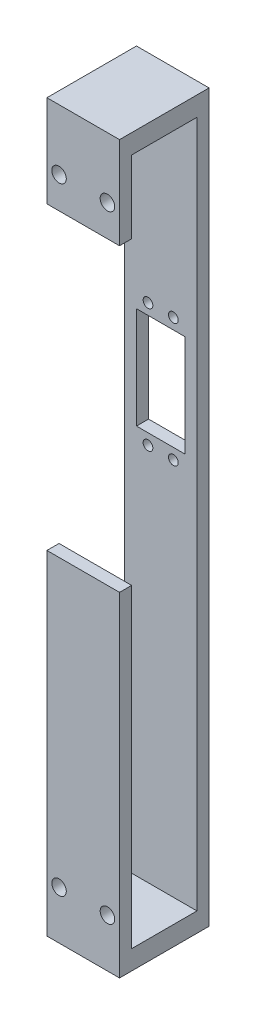
ISO-10303-21;
HEADER;
FILE_DESCRIPTION(('STEP AP214'),'2;1');
FILE_NAME('part.step','',(''),(''),'','','');
FILE_SCHEMA(('AUTOMOTIVE_DESIGN { 1 0 10303 214 1 1 1 1 }'));
ENDSEC;
DATA;
#1=APPLICATION_CONTEXT('core data for automotive mechanical design processes');
#2=APPLICATION_PROTOCOL_DEFINITION('international standard','automotive_design',2000,#1);
#3=PRODUCT_CONTEXT('',#1,'mechanical');
#4=PRODUCT('Part','Part','',(#3));
#5=PRODUCT_RELATED_PRODUCT_CATEGORY('part','',(#4));
#6=PRODUCT_DEFINITION_FORMATION('','',#4);
#7=PRODUCT_DEFINITION_CONTEXT('part definition',#1,'design');
#8=PRODUCT_DEFINITION('design','',#6,#7);
#9=PRODUCT_DEFINITION_SHAPE('','',#8);
#10=(LENGTH_UNIT() NAMED_UNIT(*) SI_UNIT(.MILLI.,.METRE.));
#11=(NAMED_UNIT(*) PLANE_ANGLE_UNIT() SI_UNIT($,.RADIAN.));
#12=(NAMED_UNIT(*) SI_UNIT($,.STERADIAN.) SOLID_ANGLE_UNIT());
#13=UNCERTAINTY_MEASURE_WITH_UNIT(LENGTH_MEASURE(1.E-05),#10,'distance_accuracy_value','');
#14=(GEOMETRIC_REPRESENTATION_CONTEXT(3) GLOBAL_UNCERTAINTY_ASSIGNED_CONTEXT((#13)) GLOBAL_UNIT_ASSIGNED_CONTEXT((#10,
#11,#12)) REPRESENTATION_CONTEXT('',''));
#15=CARTESIAN_POINT('',(0.,0.,0.));
#16=DIRECTION('',(0.,0.,1.));
#17=DIRECTION('',(1.,0.,0.));
#18=AXIS2_PLACEMENT_3D('',#15,#16,#17);
#19=CARTESIAN_POINT('',(0.,0.,37.));
#20=DIRECTION('',(0.,0.,1.));
#21=DIRECTION('',(1.,0.,0.));
#22=AXIS2_PLACEMENT_3D('',#19,#20,#21);
#23=PLANE('',#22);
#24=DIRECTION('',(0.,-1.,0.));
#25=VECTOR('',#24,1.);
#26=CARTESIAN_POINT('',(-4.99999999999999,-102.,37.));
#27=LINE('',#26,#25);
#28=CARTESIAN_POINT('',(-4.99999999999998,-72.,37.));
#29=VERTEX_POINT('',#28);
#30=CARTESIAN_POINT('',(-5.,-210.,37.));
#31=VERTEX_POINT('',#30);
#32=EDGE_CURVE('E285',#29,#31,#27,.T.);
#33=ORIENTED_EDGE('',*,*,#32,.T.);
#34=DIRECTION('',(-1.,0.,0.));
#35=VECTOR('',#34,1.);
#36=CARTESIAN_POINT('',(25.,-210.,37.));
#37=LINE('',#36,#35);
#38=CARTESIAN_POINT('',(25.,-210.,37.));
#39=VERTEX_POINT('',#38);
#40=EDGE_CURVE('E232',#39,#31,#37,.T.);
#41=ORIENTED_EDGE('',*,*,#40,.F.);
#42=DIRECTION('',(0.,1.,0.));
#43=VECTOR('',#42,1.);
#44=CARTESIAN_POINT('',(25.,-110.,37.));
#45=LINE('',#44,#43);
#46=CARTESIAN_POINT('',(25.,-72.,37.));
#47=VERTEX_POINT('',#46);
#48=EDGE_CURVE('E283',#39,#47,#45,.T.);
#49=ORIENTED_EDGE('',*,*,#48,.T.);
#50=DIRECTION('',(1.,0.,0.));
#51=VECTOR('',#50,1.);
#52=CARTESIAN_POINT('',(0.,-72.,37.));
#53=LINE('',#52,#51);
#54=EDGE_CURVE('E261',#29,#47,#53,.T.);
#55=ORIENTED_EDGE('',*,*,#54,.F.);
#56=EDGE_LOOP('',(#33,#41,#49,#55));
#57=FACE_BOUND('',#56,.T.);
#58=CARTESIAN_POINT('',(20.,-190.,37.));
#59=DIRECTION('',(0.,0.,1.));
#60=DIRECTION('',(1.,0.,0.));
#61=AXIS2_PLACEMENT_3D('',#58,#59,#60);
#62=CIRCLE('',#61,3.);
#63=CARTESIAN_POINT('',(23.,-190.,37.));
#64=VERTEX_POINT('',#63);
#65=EDGE_CURVE('E198',#64,#64,#62,.T.);
#66=ORIENTED_EDGE('',*,*,#65,.F.);
#67=EDGE_LOOP('',(#66));
#68=FACE_BOUND('',#67,.T.);
#69=CARTESIAN_POINT('',(0.,-190.,37.));
#70=DIRECTION('',(0.,0.,1.));
#71=DIRECTION('',(1.,0.,0.));
#72=AXIS2_PLACEMENT_3D('',#69,#70,#71);
#73=CIRCLE('',#72,3.);
#74=CARTESIAN_POINT('',(3.,-190.,37.));
#75=VERTEX_POINT('',#74);
#76=EDGE_CURVE('E199',#75,#75,#73,.F.);
#77=ORIENTED_EDGE('',*,*,#76,.T.);
#78=EDGE_LOOP('',(#77));
#79=FACE_BOUND('',#78,.T.);
#80=ADVANCED_FACE('F44',(#57,#68,#79),#23,.T.);
#81=CARTESIAN_POINT('',(0.,-72.,32.));
#82=DIRECTION('',(0.,0.,1.));
#83=DIRECTION('',(1.,0.,0.));
#84=AXIS2_PLACEMENT_3D('',#81,#82,#83);
#85=PLANE('',#84);
#86=CARTESIAN_POINT('',(20.,-190.,32.));
#87=DIRECTION('',(0.,0.,1.));
#88=DIRECTION('',(1.,0.,0.));
#89=AXIS2_PLACEMENT_3D('',#86,#87,#88);
#90=CIRCLE('',#89,3.);
#91=CARTESIAN_POINT('',(23.,-190.,32.));
#92=VERTEX_POINT('',#91);
#93=EDGE_CURVE('E202',#92,#92,#90,.T.);
#94=ORIENTED_EDGE('',*,*,#93,.T.);
#95=EDGE_LOOP('',(#94));
#96=FACE_BOUND('',#95,.T.);
#97=DIRECTION('',(0.,-1.,0.));
#98=VECTOR('',#97,1.);
#99=CARTESIAN_POINT('',(25.,-72.,32.));
#100=LINE('',#99,#98);
#101=CARTESIAN_POINT('',(25.,-72.,32.));
#102=VERTEX_POINT('',#101);
#103=CARTESIAN_POINT('',(25.,-202.,32.));
#104=VERTEX_POINT('',#103);
#105=EDGE_CURVE('E266',#102,#104,#100,.T.);
#106=ORIENTED_EDGE('',*,*,#105,.T.);
#107=DIRECTION('',(1.,0.,0.));
#108=VECTOR('',#107,1.);
#109=CARTESIAN_POINT('',(-5.,-202.,32.));
#110=LINE('',#109,#108);
#111=CARTESIAN_POINT('',(-5.,-202.,32.));
#112=VERTEX_POINT('',#111);
#113=EDGE_CURVE('E208',#112,#104,#110,.T.);
#114=ORIENTED_EDGE('',*,*,#113,.F.);
#115=DIRECTION('',(0.,-1.,0.));
#116=VECTOR('',#115,1.);
#117=CARTESIAN_POINT('',(-4.99999999999999,-72.,32.));
#118=LINE('',#117,#116);
#119=CARTESIAN_POINT('',(-4.99999999999999,-72.,32.));
#120=VERTEX_POINT('',#119);
#121=EDGE_CURVE('E264',#120,#112,#118,.T.);
#122=ORIENTED_EDGE('',*,*,#121,.F.);
#123=DIRECTION('',(-1.,0.,0.));
#124=VECTOR('',#123,1.);
#125=CARTESIAN_POINT('',(0.,-72.,32.));
#126=LINE('',#125,#124);
#127=EDGE_CURVE('E256',#102,#120,#126,.T.);
#128=ORIENTED_EDGE('',*,*,#127,.F.);
#129=EDGE_LOOP('',(#106,#114,#122,#128));
#130=FACE_BOUND('',#129,.T.);
#131=CARTESIAN_POINT('',(0.,-190.,32.));
#132=DIRECTION('',(0.,0.,1.));
#133=DIRECTION('',(1.,0.,0.));
#134=AXIS2_PLACEMENT_3D('',#131,#132,#133);
#135=CIRCLE('',#134,3.);
#136=CARTESIAN_POINT('',(3.,-190.,32.));
#137=VERTEX_POINT('',#136);
#138=EDGE_CURVE('E48',#137,#137,#135,.F.);
#139=ORIENTED_EDGE('',*,*,#138,.F.);
#140=EDGE_LOOP('',(#139));
#141=FACE_BOUND('',#140,.T.);
#142=ADVANCED_FACE('F336',(#96,#130,#141),#85,.F.);
#143=CARTESIAN_POINT('',(0.,0.,37.));
#144=DIRECTION('',(0.,0.,1.));
#145=DIRECTION('',(1.,0.,0.));
#146=AXIS2_PLACEMENT_3D('',#143,#144,#145);
#147=PLANE('',#146);
#148=CARTESIAN_POINT('',(0.,65.,37.));
#149=DIRECTION('',(0.,0.,1.));
#150=DIRECTION('',(1.,0.,0.));
#151=AXIS2_PLACEMENT_3D('',#148,#149,#150);
#152=CIRCLE('',#151,3.);
#153=CARTESIAN_POINT('',(3.00000000000001,65.,37.));
#154=VERTEX_POINT('',#153);
#155=EDGE_CURVE('E218',#154,#154,#152,.F.);
#156=ORIENTED_EDGE('',*,*,#155,.T.);
#157=EDGE_LOOP('',(#156));
#158=FACE_BOUND('',#157,.T.);
#159=DIRECTION('',(0.,1.,0.));
#160=VECTOR('',#159,1.);
#161=CARTESIAN_POINT('',(25.,82.,37.));
#162=LINE('',#161,#160);
#163=CARTESIAN_POINT('',(25.,52.,37.));
#164=VERTEX_POINT('',#163);
#165=CARTESIAN_POINT('',(25.,90.,37.));
#166=VERTEX_POINT('',#165);
#167=EDGE_CURVE('E269',#164,#166,#162,.T.);
#168=ORIENTED_EDGE('',*,*,#167,.T.);
#169=DIRECTION('',(-1.,0.,0.));
#170=VECTOR('',#169,1.);
#171=CARTESIAN_POINT('',(25.,90.,37.));
#172=LINE('',#171,#170);
#173=CARTESIAN_POINT('',(-5.,90.,37.));
#174=VERTEX_POINT('',#173);
#175=EDGE_CURVE('E272',#166,#174,#172,.T.);
#176=ORIENTED_EDGE('',*,*,#175,.T.);
#177=DIRECTION('',(0.,-1.,0.));
#178=VECTOR('',#177,1.);
#179=CARTESIAN_POINT('',(-5.,90.,37.));
#180=LINE('',#179,#178);
#181=CARTESIAN_POINT('',(-4.99999999999999,52.,37.));
#182=VERTEX_POINT('',#181);
#183=EDGE_CURVE('E275',#174,#182,#180,.T.);
#184=ORIENTED_EDGE('',*,*,#183,.T.);
#185=DIRECTION('',(-1.,0.,0.));
#186=VECTOR('',#185,1.);
#187=CARTESIAN_POINT('',(-4.99999999999999,52.,37.));
#188=LINE('',#187,#186);
#189=EDGE_CURVE('E237',#164,#182,#188,.T.);
#190=ORIENTED_EDGE('',*,*,#189,.F.);
#191=EDGE_LOOP('',(#168,#176,#184,#190));
#192=FACE_BOUND('',#191,.T.);
#193=CARTESIAN_POINT('',(20.,65.,37.));
#194=DIRECTION('',(0.,0.,1.));
#195=DIRECTION('',(1.,0.,0.));
#196=AXIS2_PLACEMENT_3D('',#193,#194,#195);
#197=CIRCLE('',#196,3.);
#198=CARTESIAN_POINT('',(23.,65.,37.));
#199=VERTEX_POINT('',#198);
#200=EDGE_CURVE('E222',#199,#199,#197,.T.);
#201=ORIENTED_EDGE('',*,*,#200,.F.);
#202=EDGE_LOOP('',(#201));
#203=FACE_BOUND('',#202,.T.);
#204=ADVANCED_FACE('F338',(#158,#192,#203),#147,.T.);
#205=CARTESIAN_POINT('',(25.,52.,32.));
#206=DIRECTION('',(0.,0.,1.));
#207=DIRECTION('',(1.,0.,0.));
#208=AXIS2_PLACEMENT_3D('',#205,#206,#207);
#209=PLANE('',#208);
#210=DIRECTION('',(1.,0.,0.));
#211=VECTOR('',#210,1.);
#212=CARTESIAN_POINT('',(25.,82.,32.));
#213=LINE('',#212,#211);
#214=CARTESIAN_POINT('',(-4.99999999999999,82.,32.));
#215=VERTEX_POINT('',#214);
#216=CARTESIAN_POINT('',(25.,82.,32.));
#217=VERTEX_POINT('',#216);
#218=EDGE_CURVE('E235',#215,#217,#213,.T.);
#219=ORIENTED_EDGE('',*,*,#218,.T.);
#220=DIRECTION('',(0.,1.,0.));
#221=VECTOR('',#220,1.);
#222=CARTESIAN_POINT('',(25.,52.,32.));
#223=LINE('',#222,#221);
#224=CARTESIAN_POINT('',(25.,52.,32.));
#225=VERTEX_POINT('',#224);
#226=EDGE_CURVE('E247',#225,#217,#223,.T.);
#227=ORIENTED_EDGE('',*,*,#226,.F.);
#228=DIRECTION('',(1.,0.,0.));
#229=VECTOR('',#228,1.);
#230=CARTESIAN_POINT('',(25.,52.,32.));
#231=LINE('',#230,#229);
#232=CARTESIAN_POINT('',(-4.99999999999999,52.,32.));
#233=VERTEX_POINT('',#232);
#234=EDGE_CURVE('E242',#233,#225,#231,.T.);
#235=ORIENTED_EDGE('',*,*,#234,.F.);
#236=DIRECTION('',(0.,1.,0.));
#237=VECTOR('',#236,1.);
#238=CARTESIAN_POINT('',(-4.99999999999999,52.,32.));
#239=LINE('',#238,#237);
#240=EDGE_CURVE('E251',#233,#215,#239,.T.);
#241=ORIENTED_EDGE('',*,*,#240,.T.);
#242=EDGE_LOOP('',(#219,#227,#235,#241));
#243=FACE_BOUND('',#242,.T.);
#244=CARTESIAN_POINT('',(0.,65.,32.));
#245=DIRECTION('',(0.,0.,1.));
#246=DIRECTION('',(1.,0.,0.));
#247=AXIS2_PLACEMENT_3D('',#244,#245,#246);
#248=CIRCLE('',#247,3.);
#249=CARTESIAN_POINT('',(3.00000000000001,65.,32.));
#250=VERTEX_POINT('',#249);
#251=EDGE_CURVE('E215',#250,#250,#248,.F.);
#252=ORIENTED_EDGE('',*,*,#251,.F.);
#253=EDGE_LOOP('',(#252));
#254=FACE_BOUND('',#253,.T.);
#255=CARTESIAN_POINT('',(20.,65.,32.));
#256=DIRECTION('',(0.,0.,1.));
#257=DIRECTION('',(1.,0.,0.));
#258=AXIS2_PLACEMENT_3D('',#255,#256,#257);
#259=CIRCLE('',#258,3.);
#260=CARTESIAN_POINT('',(23.,65.,32.));
#261=VERTEX_POINT('',#260);
#262=EDGE_CURVE('E221',#261,#261,#259,.T.);
#263=ORIENTED_EDGE('',*,*,#262,.T.);
#264=EDGE_LOOP('',(#263));
#265=FACE_BOUND('',#264,.T.);
#266=ADVANCED_FACE('F344',(#243,#254,#265),#209,.F.);
#267=CARTESIAN_POINT('',(-5.,82.,37.));
#268=DIRECTION('',(0.,1.,0.));
#269=DIRECTION('',(0.,0.,1.));
#270=AXIS2_PLACEMENT_3D('',#267,#268,#269);
#271=PLANE('',#270);
#272=ORIENTED_EDGE('',*,*,#218,.F.);
#273=DIRECTION('',(0.,0.,-1.));
#274=VECTOR('',#273,1.);
#275=CARTESIAN_POINT('',(-5.,82.,37.));
#276=LINE('',#275,#274);
#277=CARTESIAN_POINT('',(-5.,82.,5.));
#278=VERTEX_POINT('',#277);
#279=EDGE_CURVE('E281',#215,#278,#276,.T.);
#280=ORIENTED_EDGE('',*,*,#279,.T.);
#281=DIRECTION('',(1.,0.,0.));
#282=VECTOR('',#281,1.);
#283=CARTESIAN_POINT('',(-5.,82.,5.));
#284=LINE('',#283,#282);
#285=CARTESIAN_POINT('',(25.,82.,5.));
#286=VERTEX_POINT('',#285);
#287=EDGE_CURVE('E268',#278,#286,#284,.T.);
#288=ORIENTED_EDGE('',*,*,#287,.T.);
#289=DIRECTION('',(0.,0.,-1.));
#290=VECTOR('',#289,1.);
#291=CARTESIAN_POINT('',(25.,82.,37.));
#292=LINE('',#291,#290);
#293=EDGE_CURVE('E277',#217,#286,#292,.T.);
#294=ORIENTED_EDGE('',*,*,#293,.F.);
#295=EDGE_LOOP('',(#272,#280,#288,#294));
#296=FACE_BOUND('',#295,.T.);
#297=ADVANCED_FACE('F354',(#296),#271,.F.);
#298=CARTESIAN_POINT('',(0.,0.,5.));
#299=DIRECTION('',(0.,0.,-1.));
#300=DIRECTION('',(-1.,0.,0.));
#301=AXIS2_PLACEMENT_3D('',#298,#299,#300);
#302=PLANE('',#301);
#303=ORIENTED_EDGE('',*,*,#287,.F.);
#304=DIRECTION('',(0.,-1.,0.));
#305=VECTOR('',#304,1.);
#306=CARTESIAN_POINT('',(-5.,-50.,5.));
#307=LINE('',#306,#305);
#308=CARTESIAN_POINT('',(-5.,-202.,4.99999999999999));
#309=VERTEX_POINT('',#308);
#310=EDGE_CURVE('E53',#278,#309,#307,.T.);
#311=ORIENTED_EDGE('',*,*,#310,.T.);
#312=DIRECTION('',(1.,0.,0.));
#313=VECTOR('',#312,1.);
#314=CARTESIAN_POINT('',(-5.,-202.,4.99999999999999));
#315=LINE('',#314,#313);
#316=CARTESIAN_POINT('',(25.,-202.,4.99999999999999));
#317=VERTEX_POINT('',#316);
#318=EDGE_CURVE('E212',#309,#317,#315,.T.);
#319=ORIENTED_EDGE('',*,*,#318,.T.);
#320=DIRECTION('',(0.,1.,0.));
#321=VECTOR('',#320,1.);
#322=CARTESIAN_POINT('',(25.,10.,5.));
#323=LINE('',#322,#321);
#324=EDGE_CURVE('E12',#317,#286,#323,.T.);
#325=ORIENTED_EDGE('',*,*,#324,.T.);
#326=EDGE_LOOP('',(#303,#311,#319,#325));
#327=FACE_BOUND('',#326,.T.);
#328=CARTESIAN_POINT('',(4.75,-45.5,5.));
#329=DIRECTION('',(0.,0.,1.));
#330=DIRECTION('',(1.,0.,0.));
#331=AXIS2_PLACEMENT_3D('',#328,#329,#330);
#332=CIRCLE('',#331,1.99999999999994);
#333=CARTESIAN_POINT('',(6.74999999999994,-45.5,5.));
#334=VERTEX_POINT('',#333);
#335=EDGE_CURVE('E294',#334,#334,#332,.T.);
#336=ORIENTED_EDGE('',*,*,#335,.F.);
#337=EDGE_LOOP('',(#336));
#338=FACE_BOUND('',#337,.T.);
#339=CARTESIAN_POINT('',(15.25,-45.5,5.));
#340=DIRECTION('',(0.,0.,1.));
#341=DIRECTION('',(1.,0.,0.));
#342=AXIS2_PLACEMENT_3D('',#339,#340,#341);
#343=CIRCLE('',#342,1.99999999999993);
#344=CARTESIAN_POINT('',(17.2499999999999,-45.5,5.));
#345=VERTEX_POINT('',#344);
#346=EDGE_CURVE('E305',#345,#345,#343,.F.);
#347=ORIENTED_EDGE('',*,*,#346,.T.);
#348=EDGE_LOOP('',(#347));
#349=FACE_BOUND('',#348,.T.);
#350=DIRECTION('',(-1.,0.,0.));
#351=VECTOR('',#350,1.);
#352=CARTESIAN_POINT('',(0.,-41.,5.));
#353=LINE('',#352,#351);
#354=CARTESIAN_POINT('',(20.,-41.,5.));
#355=VERTEX_POINT('',#354);
#356=CARTESIAN_POINT('',(0.,-41.,5.));
#357=VERTEX_POINT('',#356);
#358=EDGE_CURVE('E180',#355,#357,#353,.T.);
#359=ORIENTED_EDGE('',*,*,#358,.T.);
#360=DIRECTION('',(0.,-1.,0.));
#361=VECTOR('',#360,1.);
#362=CARTESIAN_POINT('',(0.,0.,5.));
#363=LINE('',#362,#361);
#364=CARTESIAN_POINT('',(0.,1.,5.));
#365=VERTEX_POINT('',#364);
#366=EDGE_CURVE('E170',#365,#357,#363,.T.);
#367=ORIENTED_EDGE('',*,*,#366,.F.);
#368=DIRECTION('',(1.,0.,0.));
#369=VECTOR('',#368,1.);
#370=CARTESIAN_POINT('',(0.,1.,5.));
#371=LINE('',#370,#369);
#372=CARTESIAN_POINT('',(20.,1.,5.));
#373=VERTEX_POINT('',#372);
#374=EDGE_CURVE('E189',#365,#373,#371,.T.);
#375=ORIENTED_EDGE('',*,*,#374,.T.);
#376=DIRECTION('',(0.,1.,0.));
#377=VECTOR('',#376,1.);
#378=CARTESIAN_POINT('',(20.,0.,5.));
#379=LINE('',#378,#377);
#380=EDGE_CURVE('E319',#355,#373,#379,.T.);
#381=ORIENTED_EDGE('',*,*,#380,.F.);
#382=EDGE_LOOP('',(#359,#367,#375,#381));
#383=FACE_BOUND('',#382,.T.);
#384=CARTESIAN_POINT('',(4.75,5.50000000000003,5.));
#385=DIRECTION('',(0.,0.,1.));
#386=DIRECTION('',(1.,0.,0.));
#387=AXIS2_PLACEMENT_3D('',#384,#385,#386);
#388=CIRCLE('',#387,2.);
#389=CARTESIAN_POINT('',(6.75,5.50000000000003,5.));
#390=VERTEX_POINT('',#389);
#391=EDGE_CURVE('E298',#390,#390,#388,.F.);
#392=ORIENTED_EDGE('',*,*,#391,.T.);
#393=EDGE_LOOP('',(#392));
#394=FACE_BOUND('',#393,.T.);
#395=CARTESIAN_POINT('',(15.25,5.50000000000003,5.));
#396=DIRECTION('',(0.,0.,1.));
#397=DIRECTION('',(1.,0.,0.));
#398=AXIS2_PLACEMENT_3D('',#395,#396,#397);
#399=CIRCLE('',#398,2.);
#400=CARTESIAN_POINT('',(17.25,5.50000000000003,5.));
#401=VERTEX_POINT('',#400);
#402=EDGE_CURVE('E299',#401,#401,#399,.T.);
#403=ORIENTED_EDGE('',*,*,#402,.F.);
#404=EDGE_LOOP('',(#403));
#405=FACE_BOUND('',#404,.T.);
#406=ADVANCED_FACE('F356',(#327,#338,#349,#383,#394,#405),#302,.F.);
#407=CARTESIAN_POINT('',(-5.,-50.,5.));
#408=DIRECTION('',(1.,0.,0.));
#409=DIRECTION('',(0.,0.,-1.));
#410=AXIS2_PLACEMENT_3D('',#407,#408,#409);
#411=PLANE('',#410);
#412=DIRECTION('',(0.,0.,-1.));
#413=VECTOR('',#412,1.);
#414=CARTESIAN_POINT('',(-5.,-202.,4.99999999999999));
#415=LINE('',#414,#413);
#416=EDGE_CURVE('E205',#112,#309,#415,.T.);
#417=ORIENTED_EDGE('',*,*,#416,.T.);
#418=ORIENTED_EDGE('',*,*,#310,.F.);
#419=ORIENTED_EDGE('',*,*,#279,.F.);
#420=ORIENTED_EDGE('',*,*,#240,.F.);
#421=DIRECTION('',(0.,0.,-1.));
#422=VECTOR('',#421,1.);
#423=CARTESIAN_POINT('',(-4.99999999999999,52.,37.));
#424=LINE('',#423,#422);
#425=EDGE_CURVE('E240',#182,#233,#424,.T.);
#426=ORIENTED_EDGE('',*,*,#425,.F.);
#427=ORIENTED_EDGE('',*,*,#183,.F.);
#428=DIRECTION('',(0.,0.,1.));
#429=VECTOR('',#428,1.);
#430=CARTESIAN_POINT('',(-5.,90.,0.));
#431=LINE('',#430,#429);
#432=CARTESIAN_POINT('',(-5.,90.,0.));
#433=VERTEX_POINT('',#432);
#434=EDGE_CURVE('E290',#433,#174,#431,.T.);
#435=ORIENTED_EDGE('',*,*,#434,.F.);
#436=DIRECTION('',(0.,-1.,0.));
#437=VECTOR('',#436,1.);
#438=CARTESIAN_POINT('',(-5.,-50.,0.));
#439=LINE('',#438,#437);
#440=CARTESIAN_POINT('',(-5.,-210.,0.));
#441=VERTEX_POINT('',#440);
#442=EDGE_CURVE('E69',#433,#441,#439,.T.);
#443=ORIENTED_EDGE('',*,*,#442,.T.);
#444=DIRECTION('',(0.,0.,1.));
#445=VECTOR('',#444,1.);
#446=CARTESIAN_POINT('',(-5.,-210.,0.));
#447=LINE('',#446,#445);
#448=EDGE_CURVE('E225',#441,#31,#447,.T.);
#449=ORIENTED_EDGE('',*,*,#448,.T.);
#450=ORIENTED_EDGE('',*,*,#32,.F.);
#451=DIRECTION('',(0.,0.,1.));
#452=VECTOR('',#451,1.);
#453=CARTESIAN_POINT('',(-4.99999999999999,-72.,0.));
#454=LINE('',#453,#452);
#455=EDGE_CURVE('E258',#120,#29,#454,.T.);
#456=ORIENTED_EDGE('',*,*,#455,.F.);
#457=ORIENTED_EDGE('',*,*,#121,.T.);
#458=EDGE_LOOP('',(#417,#418,#419,#420,#426,#427,#435,#443,#449,#450,#456,#457));
#459=FACE_BOUND('',#458,.T.);
#460=ADVANCED_FACE('F46',(#459),#411,.F.);
#461=CARTESIAN_POINT('',(25.,10.,5.));
#462=DIRECTION('',(-1.,0.,0.));
#463=DIRECTION('',(0.,0.,1.));
#464=AXIS2_PLACEMENT_3D('',#461,#462,#463);
#465=PLANE('',#464);
#466=ORIENTED_EDGE('',*,*,#324,.F.);
#467=DIRECTION('',(0.,0.,-1.));
#468=VECTOR('',#467,1.);
#469=CARTESIAN_POINT('',(25.,-202.,4.99999999999999));
#470=LINE('',#469,#468);
#471=EDGE_CURVE('E209',#104,#317,#470,.T.);
#472=ORIENTED_EDGE('',*,*,#471,.F.);
#473=ORIENTED_EDGE('',*,*,#105,.F.);
#474=DIRECTION('',(0.,0.,-1.));
#475=VECTOR('',#474,1.);
#476=CARTESIAN_POINT('',(25.,-72.,0.));
#477=LINE('',#476,#475);
#478=EDGE_CURVE('E253',#47,#102,#477,.T.);
#479=ORIENTED_EDGE('',*,*,#478,.F.);
#480=ORIENTED_EDGE('',*,*,#48,.F.);
#481=DIRECTION('',(0.,0.,1.));
#482=VECTOR('',#481,1.);
#483=CARTESIAN_POINT('',(25.,-210.,0.));
#484=LINE('',#483,#482);
#485=CARTESIAN_POINT('',(25.,-210.,0.));
#486=VERTEX_POINT('',#485);
#487=EDGE_CURVE('E226',#486,#39,#484,.T.);
#488=ORIENTED_EDGE('',*,*,#487,.F.);
#489=DIRECTION('',(0.,1.,0.));
#490=VECTOR('',#489,1.);
#491=CARTESIAN_POINT('',(25.,10.,0.));
#492=LINE('',#491,#490);
#493=CARTESIAN_POINT('',(25.,90.,0.));
#494=VERTEX_POINT('',#493);
#495=EDGE_CURVE('E61',#486,#494,#492,.T.);
#496=ORIENTED_EDGE('',*,*,#495,.T.);
#497=DIRECTION('',(0.,0.,-1.));
#498=VECTOR('',#497,1.);
#499=CARTESIAN_POINT('',(25.,90.,5.));
#500=LINE('',#499,#498);
#501=EDGE_CURVE('E292',#166,#494,#500,.T.);
#502=ORIENTED_EDGE('',*,*,#501,.F.);
#503=ORIENTED_EDGE('',*,*,#167,.F.);
#504=DIRECTION('',(0.,0.,1.));
#505=VECTOR('',#504,1.);
#506=CARTESIAN_POINT('',(25.,52.,37.));
#507=LINE('',#506,#505);
#508=EDGE_CURVE('E244',#225,#164,#507,.T.);
#509=ORIENTED_EDGE('',*,*,#508,.F.);
#510=ORIENTED_EDGE('',*,*,#226,.T.);
#511=ORIENTED_EDGE('',*,*,#293,.T.);
#512=EDGE_LOOP('',(#466,#472,#473,#479,#480,#488,#496,#502,#503,#509,#510,#511));
#513=FACE_BOUND('',#512,.T.);
#514=ADVANCED_FACE('F389',(#513),#465,.F.);
#515=CARTESIAN_POINT('',(0.,0.,0.));
#516=DIRECTION('',(0.,0.,-1.));
#517=DIRECTION('',(-1.,0.,0.));
#518=AXIS2_PLACEMENT_3D('',#515,#516,#517);
#519=PLANE('',#518);
#520=DIRECTION('',(0.,-1.,0.));
#521=VECTOR('',#520,1.);
#522=CARTESIAN_POINT('',(0.,0.,0.));
#523=LINE('',#522,#521);
#524=CARTESIAN_POINT('',(0.,1.,0.));
#525=VERTEX_POINT('',#524);
#526=CARTESIAN_POINT('',(0.,-41.,0.));
#527=VERTEX_POINT('',#526);
#528=EDGE_CURVE('E171',#525,#527,#523,.T.);
#529=ORIENTED_EDGE('',*,*,#528,.T.);
#530=DIRECTION('',(-1.,0.,0.));
#531=VECTOR('',#530,1.);
#532=CARTESIAN_POINT('',(0.,-41.,0.));
#533=LINE('',#532,#531);
#534=CARTESIAN_POINT('',(20.,-41.,0.));
#535=VERTEX_POINT('',#534);
#536=EDGE_CURVE('E178',#535,#527,#533,.T.);
#537=ORIENTED_EDGE('',*,*,#536,.F.);
#538=DIRECTION('',(0.,1.,0.));
#539=VECTOR('',#538,1.);
#540=CARTESIAN_POINT('',(20.,0.,0.));
#541=LINE('',#540,#539);
#542=CARTESIAN_POINT('',(20.,1.,0.));
#543=VERTEX_POINT('',#542);
#544=EDGE_CURVE('E160',#535,#543,#541,.T.);
#545=ORIENTED_EDGE('',*,*,#544,.T.);
#546=DIRECTION('',(1.,0.,0.));
#547=VECTOR('',#546,1.);
#548=CARTESIAN_POINT('',(0.,1.,0.));
#549=LINE('',#548,#547);
#550=EDGE_CURVE('E191',#525,#543,#549,.T.);
#551=ORIENTED_EDGE('',*,*,#550,.F.);
#552=EDGE_LOOP('',(#529,#537,#545,#551));
#553=FACE_BOUND('',#552,.T.);
#554=ORIENTED_EDGE('',*,*,#442,.F.);
#555=DIRECTION('',(-1.,0.,0.));
#556=VECTOR('',#555,1.);
#557=CARTESIAN_POINT('',(25.,90.,0.));
#558=LINE('',#557,#556);
#559=EDGE_CURVE('E287',#494,#433,#558,.T.);
#560=ORIENTED_EDGE('',*,*,#559,.F.);
#561=ORIENTED_EDGE('',*,*,#495,.F.);
#562=DIRECTION('',(-1.,0.,0.));
#563=VECTOR('',#562,1.);
#564=CARTESIAN_POINT('',(25.,-210.,0.));
#565=LINE('',#564,#563);
#566=EDGE_CURVE('E229',#486,#441,#565,.T.);
#567=ORIENTED_EDGE('',*,*,#566,.T.);
#568=EDGE_LOOP('',(#554,#560,#561,#567));
#569=FACE_BOUND('',#568,.T.);
#570=CARTESIAN_POINT('',(15.25,-45.5,0.));
#571=DIRECTION('',(0.,0.,1.));
#572=DIRECTION('',(1.,0.,0.));
#573=AXIS2_PLACEMENT_3D('',#570,#571,#572);
#574=CIRCLE('',#573,1.99999999999993);
#575=CARTESIAN_POINT('',(17.2499999999999,-45.5,0.));
#576=VERTEX_POINT('',#575);
#577=EDGE_CURVE('E302',#576,#576,#574,.F.);
#578=ORIENTED_EDGE('',*,*,#577,.F.);
#579=EDGE_LOOP('',(#578));
#580=FACE_BOUND('',#579,.T.);
#581=CARTESIAN_POINT('',(4.75,5.50000000000003,0.));
#582=DIRECTION('',(0.,0.,1.));
#583=DIRECTION('',(1.,0.,0.));
#584=AXIS2_PLACEMENT_3D('',#581,#582,#583);
#585=CIRCLE('',#584,2.);
#586=CARTESIAN_POINT('',(6.75,5.50000000000003,0.));
#587=VERTEX_POINT('',#586);
#588=EDGE_CURVE('E313',#587,#587,#585,.F.);
#589=ORIENTED_EDGE('',*,*,#588,.F.);
#590=EDGE_LOOP('',(#589));
#591=FACE_BOUND('',#590,.T.);
#592=CARTESIAN_POINT('',(15.25,5.50000000000003,0.));
#593=DIRECTION('',(0.,0.,1.));
#594=DIRECTION('',(1.,0.,0.));
#595=AXIS2_PLACEMENT_3D('',#592,#593,#594);
#596=CIRCLE('',#595,2.);
#597=CARTESIAN_POINT('',(17.25,5.50000000000003,0.));
#598=VERTEX_POINT('',#597);
#599=EDGE_CURVE('E295',#598,#598,#596,.T.);
#600=ORIENTED_EDGE('',*,*,#599,.T.);
#601=EDGE_LOOP('',(#600));
#602=FACE_BOUND('',#601,.T.);
#603=CARTESIAN_POINT('',(4.75,-45.5,0.));
#604=DIRECTION('',(0.,0.,1.));
#605=DIRECTION('',(1.,0.,0.));
#606=AXIS2_PLACEMENT_3D('',#603,#604,#605);
#607=CIRCLE('',#606,1.99999999999994);
#608=CARTESIAN_POINT('',(6.74999999999994,-45.5,0.));
#609=VERTEX_POINT('',#608);
#610=EDGE_CURVE('E308',#609,#609,#607,.T.);
#611=ORIENTED_EDGE('',*,*,#610,.T.);
#612=EDGE_LOOP('',(#611));
#613=FACE_BOUND('',#612,.T.);
#614=ADVANCED_FACE('F183',(#553,#569,#580,#591,#602,#613),#519,.T.);
#615=CARTESIAN_POINT('',(0.,0.,5.));
#616=DIRECTION('',(1.,0.,0.));
#617=DIRECTION('',(0.,1.,0.));
#618=AXIS2_PLACEMENT_3D('',#615,#616,#617);
#619=PLANE('',#618);
#620=ORIENTED_EDGE('',*,*,#528,.F.);
#621=DIRECTION('',(0.,0.,-1.));
#622=VECTOR('',#621,1.);
#623=CARTESIAN_POINT('',(0.,1.,10.));
#624=LINE('',#623,#622);
#625=EDGE_CURVE('E186',#365,#525,#624,.T.);
#626=ORIENTED_EDGE('',*,*,#625,.F.);
#627=ORIENTED_EDGE('',*,*,#366,.T.);
#628=DIRECTION('',(0.,0.,-1.));
#629=VECTOR('',#628,1.);
#630=CARTESIAN_POINT('',(0.,-41.,10.));
#631=LINE('',#630,#629);
#632=EDGE_CURVE('E181',#357,#527,#631,.T.);
#633=ORIENTED_EDGE('',*,*,#632,.T.);
#634=EDGE_LOOP('',(#620,#626,#627,#633));
#635=FACE_BOUND('',#634,.T.);
#636=ADVANCED_FACE('F381',(#635),#619,.T.);
#637=CARTESIAN_POINT('',(20.,0.,5.));
#638=DIRECTION('',(-1.,0.,0.));
#639=DIRECTION('',(0.,-1.,0.));
#640=AXIS2_PLACEMENT_3D('',#637,#638,#639);
#641=PLANE('',#640);
#642=ORIENTED_EDGE('',*,*,#544,.F.);
#643=DIRECTION('',(0.,0.,-1.));
#644=VECTOR('',#643,1.);
#645=CARTESIAN_POINT('',(20.,-41.,10.));
#646=LINE('',#645,#644);
#647=EDGE_CURVE('E163',#355,#535,#646,.T.);
#648=ORIENTED_EDGE('',*,*,#647,.F.);
#649=ORIENTED_EDGE('',*,*,#380,.T.);
#650=DIRECTION('',(0.,0.,-1.));
#651=VECTOR('',#650,1.);
#652=CARTESIAN_POINT('',(20.,1.,10.));
#653=LINE('',#652,#651);
#654=EDGE_CURVE('E165',#373,#543,#653,.T.);
#655=ORIENTED_EDGE('',*,*,#654,.T.);
#656=EDGE_LOOP('',(#642,#648,#649,#655));
#657=FACE_BOUND('',#656,.T.);
#658=ADVANCED_FACE('F162',(#657),#641,.T.);
#659=CARTESIAN_POINT('',(4.75,5.50000000000003,0.));
#660=DIRECTION('',(0.,0.,1.));
#661=DIRECTION('',(1.,0.,0.));
#662=AXIS2_PLACEMENT_3D('',#659,#660,#661);
#663=CYLINDRICAL_SURFACE('',#662,2.);
#664=ORIENTED_EDGE('',*,*,#588,.T.);
#665=EDGE_LOOP('',(#664));
#666=FACE_BOUND('',#665,.T.);
#667=ORIENTED_EDGE('',*,*,#391,.F.);
#668=EDGE_LOOP('',(#667));
#669=FACE_BOUND('',#668,.T.);
#670=ADVANCED_FACE('F368',(#666,#669),#663,.F.);
#671=CARTESIAN_POINT('',(15.25,5.50000000000003,0.));
#672=DIRECTION('',(0.,0.,1.));
#673=DIRECTION('',(1.,0.,0.));
#674=AXIS2_PLACEMENT_3D('',#671,#672,#673);
#675=CYLINDRICAL_SURFACE('',#674,2.);
#676=ORIENTED_EDGE('',*,*,#599,.F.);
#677=EDGE_LOOP('',(#676));
#678=FACE_BOUND('',#677,.T.);
#679=ORIENTED_EDGE('',*,*,#402,.T.);
#680=EDGE_LOOP('',(#679));
#681=FACE_BOUND('',#680,.T.);
#682=ADVANCED_FACE('F364',(#678,#681),#675,.F.);
#683=CARTESIAN_POINT('',(15.25,-45.5,0.));
#684=DIRECTION('',(0.,0.,1.));
#685=DIRECTION('',(1.,0.,0.));
#686=AXIS2_PLACEMENT_3D('',#683,#684,#685);
#687=CYLINDRICAL_SURFACE('',#686,1.99999999999993);
#688=ORIENTED_EDGE('',*,*,#577,.T.);
#689=EDGE_LOOP('',(#688));
#690=FACE_BOUND('',#689,.T.);
#691=ORIENTED_EDGE('',*,*,#346,.F.);
#692=EDGE_LOOP('',(#691));
#693=FACE_BOUND('',#692,.T.);
#694=ADVANCED_FACE('F367',(#690,#693),#687,.F.);
#695=CARTESIAN_POINT('',(4.75,-45.5,0.));
#696=DIRECTION('',(0.,0.,1.));
#697=DIRECTION('',(1.,0.,0.));
#698=AXIS2_PLACEMENT_3D('',#695,#696,#697);
#699=CYLINDRICAL_SURFACE('',#698,1.99999999999994);
#700=ORIENTED_EDGE('',*,*,#610,.F.);
#701=EDGE_LOOP('',(#700));
#702=FACE_BOUND('',#701,.T.);
#703=ORIENTED_EDGE('',*,*,#335,.T.);
#704=EDGE_LOOP('',(#703));
#705=FACE_BOUND('',#704,.T.);
#706=ADVANCED_FACE('F362',(#702,#705),#699,.F.);
#707=CARTESIAN_POINT('',(0.,90.,0.));
#708=DIRECTION('',(0.,1.,0.));
#709=DIRECTION('',(0.,0.,1.));
#710=AXIS2_PLACEMENT_3D('',#707,#708,#709);
#711=PLANE('',#710);
#712=ORIENTED_EDGE('',*,*,#559,.T.);
#713=ORIENTED_EDGE('',*,*,#434,.T.);
#714=ORIENTED_EDGE('',*,*,#175,.F.);
#715=ORIENTED_EDGE('',*,*,#501,.T.);
#716=EDGE_LOOP('',(#712,#713,#714,#715));
#717=FACE_BOUND('',#716,.T.);
#718=ADVANCED_FACE('F359',(#717),#711,.T.);
#719=CARTESIAN_POINT('',(0.,-72.,0.));
#720=DIRECTION('',(0.,1.,0.));
#721=DIRECTION('',(0.,0.,1.));
#722=AXIS2_PLACEMENT_3D('',#719,#720,#721);
#723=PLANE('',#722);
#724=ORIENTED_EDGE('',*,*,#478,.T.);
#725=ORIENTED_EDGE('',*,*,#127,.T.);
#726=ORIENTED_EDGE('',*,*,#455,.T.);
#727=ORIENTED_EDGE('',*,*,#54,.T.);
#728=EDGE_LOOP('',(#724,#725,#726,#727));
#729=FACE_BOUND('',#728,.T.);
#730=ADVANCED_FACE('F351',(#729),#723,.T.);
#731=CARTESIAN_POINT('',(0.,52.,0.));
#732=DIRECTION('',(0.,1.,0.));
#733=DIRECTION('',(0.,0.,1.));
#734=AXIS2_PLACEMENT_3D('',#731,#732,#733);
#735=PLANE('',#734);
#736=ORIENTED_EDGE('',*,*,#189,.T.);
#737=ORIENTED_EDGE('',*,*,#425,.T.);
#738=ORIENTED_EDGE('',*,*,#234,.T.);
#739=ORIENTED_EDGE('',*,*,#508,.T.);
#740=EDGE_LOOP('',(#736,#737,#738,#739));
#741=FACE_BOUND('',#740,.T.);
#742=ADVANCED_FACE('F423',(#741),#735,.F.);
#743=CARTESIAN_POINT('',(25.,-210.,0.));
#744=DIRECTION('',(0.,-1.,0.));
#745=DIRECTION('',(0.,0.,-1.));
#746=AXIS2_PLACEMENT_3D('',#743,#744,#745);
#747=PLANE('',#746);
#748=ORIENTED_EDGE('',*,*,#448,.F.);
#749=ORIENTED_EDGE('',*,*,#566,.F.);
#750=ORIENTED_EDGE('',*,*,#487,.T.);
#751=ORIENTED_EDGE('',*,*,#40,.T.);
#752=EDGE_LOOP('',(#748,#749,#750,#751));
#753=FACE_BOUND('',#752,.T.);
#754=ADVANCED_FACE('F416',(#753),#747,.T.);
#755=CARTESIAN_POINT('',(0.,65.,55.));
#756=DIRECTION('',(0.,0.,-1.));
#757=DIRECTION('',(-1.,0.,0.));
#758=AXIS2_PLACEMENT_3D('',#755,#756,#757);
#759=CYLINDRICAL_SURFACE('',#758,3.);
#760=ORIENTED_EDGE('',*,*,#155,.F.);
#761=EDGE_LOOP('',(#760));
#762=FACE_BOUND('',#761,.T.);
#763=ORIENTED_EDGE('',*,*,#251,.T.);
#764=EDGE_LOOP('',(#763));
#765=FACE_BOUND('',#764,.T.);
#766=ADVANCED_FACE('F441',(#762,#765),#759,.F.);
#767=CARTESIAN_POINT('',(20.,65.,55.));
#768=DIRECTION('',(0.,0.,-1.));
#769=DIRECTION('',(-1.,0.,0.));
#770=AXIS2_PLACEMENT_3D('',#767,#768,#769);
#771=CYLINDRICAL_SURFACE('',#770,3.);
#772=ORIENTED_EDGE('',*,*,#200,.T.);
#773=EDGE_LOOP('',(#772));
#774=FACE_BOUND('',#773,.T.);
#775=ORIENTED_EDGE('',*,*,#262,.F.);
#776=EDGE_LOOP('',(#775));
#777=FACE_BOUND('',#776,.T.);
#778=ADVANCED_FACE('F439',(#774,#777),#771,.F.);
#779=CARTESIAN_POINT('',(-5.,-202.,4.99999999999999));
#780=DIRECTION('',(0.,-1.,0.));
#781=DIRECTION('',(0.,0.,-1.));
#782=AXIS2_PLACEMENT_3D('',#779,#780,#781);
#783=PLANE('',#782);
#784=ORIENTED_EDGE('',*,*,#471,.T.);
#785=ORIENTED_EDGE('',*,*,#318,.F.);
#786=ORIENTED_EDGE('',*,*,#416,.F.);
#787=ORIENTED_EDGE('',*,*,#113,.T.);
#788=EDGE_LOOP('',(#784,#785,#786,#787));
#789=FACE_BOUND('',#788,.T.);
#790=ADVANCED_FACE('F404',(#789),#783,.F.);
#791=CARTESIAN_POINT('',(20.,-190.,7.));
#792=DIRECTION('',(0.,0.,1.));
#793=DIRECTION('',(1.,0.,0.));
#794=AXIS2_PLACEMENT_3D('',#791,#792,#793);
#795=CYLINDRICAL_SURFACE('',#794,3.);
#796=ORIENTED_EDGE('',*,*,#65,.T.);
#797=EDGE_LOOP('',(#796));
#798=FACE_BOUND('',#797,.T.);
#799=ORIENTED_EDGE('',*,*,#93,.F.);
#800=EDGE_LOOP('',(#799));
#801=FACE_BOUND('',#800,.T.);
#802=ADVANCED_FACE('F448',(#798,#801),#795,.F.);
#803=CARTESIAN_POINT('',(0.,-190.,7.));
#804=DIRECTION('',(0.,0.,1.));
#805=DIRECTION('',(1.,0.,0.));
#806=AXIS2_PLACEMENT_3D('',#803,#804,#805);
#807=CYLINDRICAL_SURFACE('',#806,3.);
#808=ORIENTED_EDGE('',*,*,#76,.F.);
#809=EDGE_LOOP('',(#808));
#810=FACE_BOUND('',#809,.T.);
#811=ORIENTED_EDGE('',*,*,#138,.T.);
#812=EDGE_LOOP('',(#811));
#813=FACE_BOUND('',#812,.T.);
#814=ADVANCED_FACE('F334',(#810,#813),#807,.F.);
#815=CARTESIAN_POINT('',(0.,1.,10.));
#816=DIRECTION('',(0.,1.,0.));
#817=DIRECTION('',(0.,0.,1.));
#818=AXIS2_PLACEMENT_3D('',#815,#816,#817);
#819=PLANE('',#818);
#820=ORIENTED_EDGE('',*,*,#625,.T.);
#821=ORIENTED_EDGE('',*,*,#550,.T.);
#822=ORIENTED_EDGE('',*,*,#654,.F.);
#823=ORIENTED_EDGE('',*,*,#374,.F.);
#824=EDGE_LOOP('',(#820,#821,#822,#823));
#825=FACE_BOUND('',#824,.T.);
#826=ADVANCED_FACE('F517',(#825),#819,.F.);
#827=CARTESIAN_POINT('',(0.,-41.,10.));
#828=DIRECTION('',(0.,-1.,0.));
#829=DIRECTION('',(0.,0.,-1.));
#830=AXIS2_PLACEMENT_3D('',#827,#828,#829);
#831=PLANE('',#830);
#832=ORIENTED_EDGE('',*,*,#647,.T.);
#833=ORIENTED_EDGE('',*,*,#536,.T.);
#834=ORIENTED_EDGE('',*,*,#632,.F.);
#835=ORIENTED_EDGE('',*,*,#358,.F.);
#836=EDGE_LOOP('',(#832,#833,#834,#835));
#837=FACE_BOUND('',#836,.T.);
#838=ADVANCED_FACE('F176',(#837),#831,.F.);
#839=CLOSED_SHELL('',(#80,#142,#204,#266,#297,#406,#460,#514,#614,#636,#658,#670,#682,#694,#706,
#718,#730,#742,#754,#766,#778,#790,#802,#814,#826,#838));
#840=MANIFOLD_SOLID_BREP('B2',#839);
#841=ADVANCED_BREP_SHAPE_REPRESENTATION('',(#18,#840),#14);
#842=SHAPE_DEFINITION_REPRESENTATION(#9,#841);
ENDSEC;
END-ISO-10303-21;
